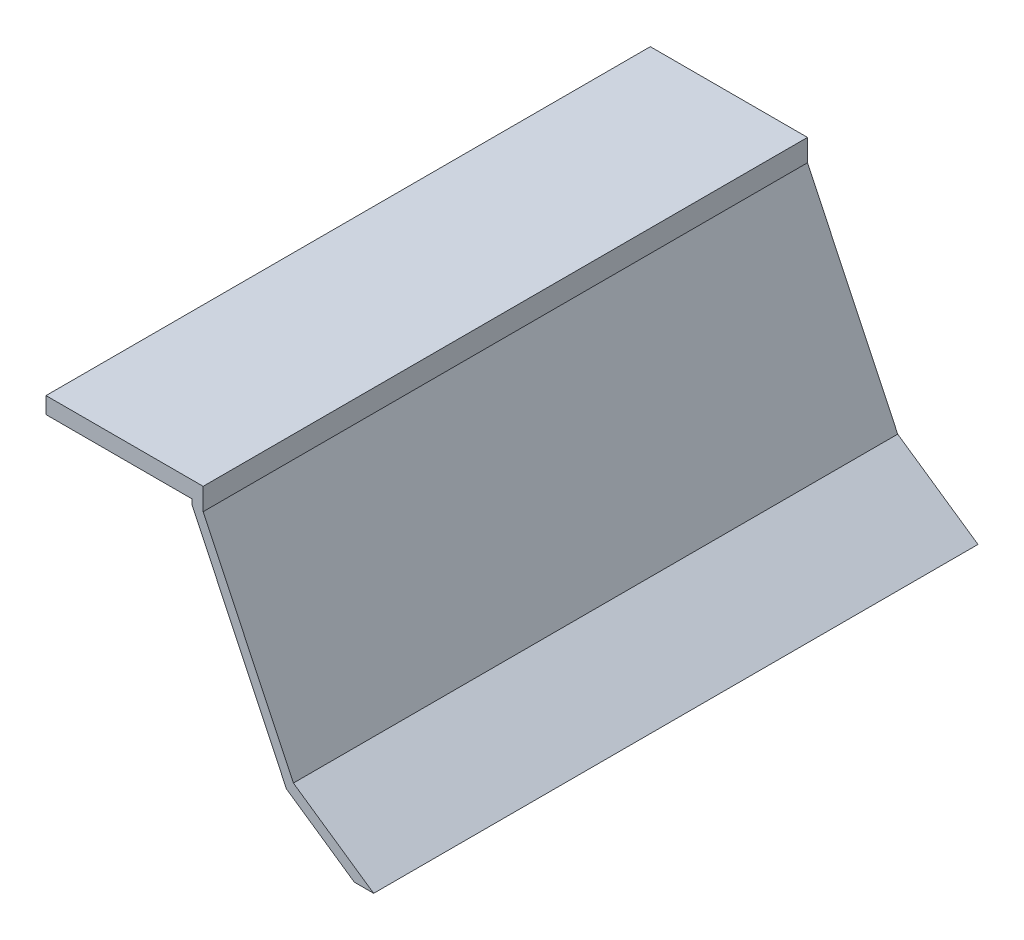
ISO-10303-21;
HEADER;
FILE_DESCRIPTION(('STEP AP214'),'2;1');
FILE_NAME('part.step','',(''),(''),'','','');
FILE_SCHEMA(('AUTOMOTIVE_DESIGN { 1 0 10303 214 1 1 1 1 }'));
ENDSEC;
DATA;
#1=APPLICATION_CONTEXT('core data for automotive mechanical design processes');
#2=APPLICATION_PROTOCOL_DEFINITION('international standard','automotive_design',2000,#1);
#3=PRODUCT_CONTEXT('',#1,'mechanical');
#4=PRODUCT('Part','Part','',(#3));
#5=PRODUCT_RELATED_PRODUCT_CATEGORY('part','',(#4));
#6=PRODUCT_DEFINITION_FORMATION('','',#4);
#7=PRODUCT_DEFINITION_CONTEXT('part definition',#1,'design');
#8=PRODUCT_DEFINITION('design','',#6,#7);
#9=PRODUCT_DEFINITION_SHAPE('','',#8);
#10=(LENGTH_UNIT() NAMED_UNIT(*) SI_UNIT(.MILLI.,.METRE.));
#11=(NAMED_UNIT(*) PLANE_ANGLE_UNIT() SI_UNIT($,.RADIAN.));
#12=(NAMED_UNIT(*) SI_UNIT($,.STERADIAN.) SOLID_ANGLE_UNIT());
#13=UNCERTAINTY_MEASURE_WITH_UNIT(LENGTH_MEASURE(1.E-05),#10,'distance_accuracy_value','');
#14=(GEOMETRIC_REPRESENTATION_CONTEXT(3) GLOBAL_UNCERTAINTY_ASSIGNED_CONTEXT((#13)) GLOBAL_UNIT_ASSIGNED_CONTEXT((#10,
#11,#12)) REPRESENTATION_CONTEXT('',''));
#15=CARTESIAN_POINT('',(0.,0.,0.));
#16=DIRECTION('',(0.,0.,1.));
#17=DIRECTION('',(1.,0.,0.));
#18=AXIS2_PLACEMENT_3D('',#15,#16,#17);
#19=CARTESIAN_POINT('',(0.,0.,110.));
#20=DIRECTION('',(1.,0.,0.));
#21=DIRECTION('',(0.,1.,0.));
#22=AXIS2_PLACEMENT_3D('',#19,#20,#21);
#23=PLANE('',#22);
#24=DIRECTION('',(0.,-1.,0.));
#25=VECTOR('',#24,1.);
#26=CARTESIAN_POINT('',(0.,0.,0.));
#27=LINE('',#26,#25);
#28=CARTESIAN_POINT('',(0.,0.,0.));
#29=VERTEX_POINT('',#28);
#30=CARTESIAN_POINT('',(0.,-3.,0.));
#31=VERTEX_POINT('',#30);
#32=EDGE_CURVE('E141',#29,#31,#27,.T.);
#33=ORIENTED_EDGE('',*,*,#32,.T.);
#34=DIRECTION('',(0.,0.,-1.));
#35=VECTOR('',#34,1.);
#36=CARTESIAN_POINT('',(0.,-3.,110.));
#37=LINE('',#36,#35);
#38=CARTESIAN_POINT('',(0.,-3.,110.));
#39=VERTEX_POINT('',#38);
#40=EDGE_CURVE('E11',#39,#31,#37,.T.);
#41=ORIENTED_EDGE('',*,*,#40,.F.);
#42=DIRECTION('',(0.,-1.,0.));
#43=VECTOR('',#42,1.);
#44=CARTESIAN_POINT('',(0.,0.,110.));
#45=LINE('',#44,#43);
#46=CARTESIAN_POINT('',(0.,0.,110.));
#47=VERTEX_POINT('',#46);
#48=EDGE_CURVE('E159',#47,#39,#45,.T.);
#49=ORIENTED_EDGE('',*,*,#48,.F.);
#50=DIRECTION('',(0.,0.,-1.));
#51=VECTOR('',#50,1.);
#52=CARTESIAN_POINT('',(0.,0.,110.));
#53=LINE('',#52,#51);
#54=EDGE_CURVE('E137',#47,#29,#53,.T.);
#55=ORIENTED_EDGE('',*,*,#54,.T.);
#56=EDGE_LOOP('',(#33,#41,#49,#55));
#57=FACE_BOUND('',#56,.T.);
#58=ADVANCED_FACE('F33',(#57),#23,.F.);
#59=CARTESIAN_POINT('',(0.,-3.,110.));
#60=DIRECTION('',(0.,1.,0.));
#61=DIRECTION('',(0.,0.,1.));
#62=AXIS2_PLACEMENT_3D('',#59,#60,#61);
#63=PLANE('',#62);
#64=DIRECTION('',(1.,0.,0.));
#65=VECTOR('',#64,1.);
#66=CARTESIAN_POINT('',(0.,-3.,0.));
#67=LINE('',#66,#65);
#68=CARTESIAN_POINT('',(26.6072373557019,-3.,0.));
#69=VERTEX_POINT('',#68);
#70=EDGE_CURVE('E144',#31,#69,#67,.T.);
#71=ORIENTED_EDGE('',*,*,#70,.T.);
#72=DIRECTION('',(0.,0.,-1.));
#73=VECTOR('',#72,1.);
#74=CARTESIAN_POINT('',(26.6072373557019,-3.,110.));
#75=LINE('',#74,#73);
#76=CARTESIAN_POINT('',(26.6072373557019,-3.,110.));
#77=VERTEX_POINT('',#76);
#78=EDGE_CURVE('E41',#77,#69,#75,.T.);
#79=ORIENTED_EDGE('',*,*,#78,.F.);
#80=DIRECTION('',(1.,0.,0.));
#81=VECTOR('',#80,1.);
#82=CARTESIAN_POINT('',(0.,-3.,110.));
#83=LINE('',#82,#81);
#84=EDGE_CURVE('E98',#39,#77,#83,.T.);
#85=ORIENTED_EDGE('',*,*,#84,.F.);
#86=ORIENTED_EDGE('',*,*,#40,.T.);
#87=EDGE_LOOP('',(#71,#79,#85,#86));
#88=FACE_BOUND('',#87,.T.);
#89=ADVANCED_FACE('F208',(#88),#63,.F.);
#90=CARTESIAN_POINT('',(26.6072373557019,-4.,110.));
#91=DIRECTION('',(1.,0.,0.));
#92=DIRECTION('',(0.,1.,0.));
#93=AXIS2_PLACEMENT_3D('',#90,#91,#92);
#94=PLANE('',#93);
#95=DIRECTION('',(0.,-1.,0.));
#96=VECTOR('',#95,1.);
#97=CARTESIAN_POINT('',(26.6072373557019,-4.,0.));
#98=LINE('',#97,#96);
#99=CARTESIAN_POINT('',(26.6072373557019,-4.,0.));
#100=VERTEX_POINT('',#99);
#101=EDGE_CURVE('E146',#69,#100,#98,.T.);
#102=ORIENTED_EDGE('',*,*,#101,.T.);
#103=DIRECTION('',(0.,0.,-1.));
#104=VECTOR('',#103,1.);
#105=CARTESIAN_POINT('',(26.6072373557019,-4.,110.));
#106=LINE('',#105,#104);
#107=CARTESIAN_POINT('',(26.6072373557019,-4.,110.));
#108=VERTEX_POINT('',#107);
#109=EDGE_CURVE('E172',#108,#100,#106,.T.);
#110=ORIENTED_EDGE('',*,*,#109,.F.);
#111=DIRECTION('',(0.,-1.,0.));
#112=VECTOR('',#111,1.);
#113=CARTESIAN_POINT('',(26.6072373557019,-4.,110.));
#114=LINE('',#113,#112);
#115=EDGE_CURVE('E180',#77,#108,#114,.T.);
#116=ORIENTED_EDGE('',*,*,#115,.F.);
#117=ORIENTED_EDGE('',*,*,#78,.T.);
#118=EDGE_LOOP('',(#102,#110,#116,#117));
#119=FACE_BOUND('',#118,.T.);
#120=ADVANCED_FACE('F178',(#119),#94,.F.);
#121=CARTESIAN_POINT('',(43.7728855673984,-40.1294965571384,110.));
#122=DIRECTION('',(0.903237413928461,0.429141205292414,0.));
#123=DIRECTION('',(-0.429141205292414,0.903237413928461,0.));
#124=AXIS2_PLACEMENT_3D('',#121,#122,#123);
#125=PLANE('',#124);
#126=DIRECTION('',(0.429141205292414,-0.903237413928461,0.));
#127=VECTOR('',#126,1.);
#128=CARTESIAN_POINT('',(43.7728855673984,-40.1294965571384,0.));
#129=LINE('',#128,#127);
#130=CARTESIAN_POINT('',(43.7728855673984,-40.1294965571384,0.));
#131=VERTEX_POINT('',#130);
#132=EDGE_CURVE('E148',#100,#131,#129,.T.);
#133=ORIENTED_EDGE('',*,*,#132,.T.);
#134=DIRECTION('',(0.,0.,-1.));
#135=VECTOR('',#134,1.);
#136=CARTESIAN_POINT('',(43.7728855673984,-40.1294965571384,110.));
#137=LINE('',#136,#135);
#138=CARTESIAN_POINT('',(43.7728855673984,-40.1294965571384,110.));
#139=VERTEX_POINT('',#138);
#140=EDGE_CURVE('E169',#139,#131,#137,.T.);
#141=ORIENTED_EDGE('',*,*,#140,.F.);
#142=DIRECTION('',(0.429141205292414,-0.903237413928461,0.));
#143=VECTOR('',#142,1.);
#144=CARTESIAN_POINT('',(43.7728855673984,-40.1294965571384,110.));
#145=LINE('',#144,#143);
#146=EDGE_CURVE('E198',#108,#139,#145,.T.);
#147=ORIENTED_EDGE('',*,*,#146,.F.);
#148=ORIENTED_EDGE('',*,*,#109,.T.);
#149=EDGE_LOOP('',(#133,#141,#147,#148));
#150=FACE_BOUND('',#149,.T.);
#151=ADVANCED_FACE('F189',(#150),#125,.F.);
#152=CARTESIAN_POINT('',(56.1218739557704,-48.6443357091044,110.));
#153=DIRECTION('',(0.5676559434644,0.823265892558134,0.));
#154=DIRECTION('',(-0.823265892558134,0.5676559434644,0.));
#155=AXIS2_PLACEMENT_3D('',#152,#153,#154);
#156=PLANE('',#155);
#157=DIRECTION('',(0.823265892558134,-0.5676559434644,0.));
#158=VECTOR('',#157,1.);
#159=CARTESIAN_POINT('',(56.1218739557704,-48.6443357091044,0.));
#160=LINE('',#159,#158);
#161=CARTESIAN_POINT('',(56.1218739557704,-48.6443357091044,0.));
#162=VERTEX_POINT('',#161);
#163=EDGE_CURVE('E150',#131,#162,#160,.T.);
#164=ORIENTED_EDGE('',*,*,#163,.T.);
#165=DIRECTION('',(0.,0.,-1.));
#166=VECTOR('',#165,1.);
#167=CARTESIAN_POINT('',(56.1218739557704,-48.6443357091044,110.));
#168=LINE('',#167,#166);
#169=CARTESIAN_POINT('',(56.1218739557704,-48.6443357091044,110.));
#170=VERTEX_POINT('',#169);
#171=EDGE_CURVE('E166',#170,#162,#168,.T.);
#172=ORIENTED_EDGE('',*,*,#171,.F.);
#173=DIRECTION('',(0.823265892558134,-0.5676559434644,0.));
#174=VECTOR('',#173,1.);
#175=CARTESIAN_POINT('',(56.1218739557704,-48.6443357091044,110.));
#176=LINE('',#175,#174);
#177=EDGE_CURVE('E195',#139,#170,#176,.T.);
#178=ORIENTED_EDGE('',*,*,#177,.F.);
#179=ORIENTED_EDGE('',*,*,#140,.T.);
#180=EDGE_LOOP('',(#164,#172,#178,#179));
#181=FACE_BOUND('',#180,.T.);
#182=ADVANCED_FACE('F193',(#181),#156,.F.);
#183=CARTESIAN_POINT('',(59.6451348729274,-48.6443357091044,110.));
#184=DIRECTION('',(0.,1.,0.));
#185=DIRECTION('',(-1.,0.,0.));
#186=AXIS2_PLACEMENT_3D('',#183,#184,#185);
#187=PLANE('',#186);
#188=DIRECTION('',(1.,0.,0.));
#189=VECTOR('',#188,1.);
#190=CARTESIAN_POINT('',(59.6451348729274,-48.6443357091044,0.));
#191=LINE('',#190,#189);
#192=CARTESIAN_POINT('',(59.6451348729274,-48.6443357091044,0.));
#193=VERTEX_POINT('',#192);
#194=EDGE_CURVE('E152',#162,#193,#191,.T.);
#195=ORIENTED_EDGE('',*,*,#194,.T.);
#196=DIRECTION('',(0.,0.,-1.));
#197=VECTOR('',#196,1.);
#198=CARTESIAN_POINT('',(59.6451348729274,-48.6443357091044,110.));
#199=LINE('',#198,#197);
#200=CARTESIAN_POINT('',(59.6451348729274,-48.6443357091044,110.));
#201=VERTEX_POINT('',#200);
#202=EDGE_CURVE('E163',#201,#193,#199,.T.);
#203=ORIENTED_EDGE('',*,*,#202,.F.);
#204=DIRECTION('',(1.,0.,0.));
#205=VECTOR('',#204,1.);
#206=CARTESIAN_POINT('',(59.6451348729274,-48.6443357091044,110.));
#207=LINE('',#206,#205);
#208=EDGE_CURVE('E197',#170,#201,#207,.T.);
#209=ORIENTED_EDGE('',*,*,#208,.F.);
#210=ORIENTED_EDGE('',*,*,#171,.T.);
#211=EDGE_LOOP('',(#195,#203,#209,#210));
#212=FACE_BOUND('',#211,.T.);
#213=ADVANCED_FACE('F220',(#212),#187,.F.);
#214=CARTESIAN_POINT('',(45.0312597898075,-38.5678183615896,110.));
#215=DIRECTION('',(-0.567655943464399,-0.823265892558135,0.));
#216=DIRECTION('',(0.823265892558135,-0.567655943464399,0.));
#217=AXIS2_PLACEMENT_3D('',#214,#215,#216);
#218=PLANE('',#217);
#219=DIRECTION('',(-0.823265892558135,0.567655943464399,0.));
#220=VECTOR('',#219,1.);
#221=CARTESIAN_POINT('',(45.0312597898075,-38.5678183615896,0.));
#222=LINE('',#221,#220);
#223=CARTESIAN_POINT('',(45.0312597898075,-38.5678183615896,0.));
#224=VERTEX_POINT('',#223);
#225=EDGE_CURVE('E154',#193,#224,#222,.T.);
#226=ORIENTED_EDGE('',*,*,#225,.T.);
#227=DIRECTION('',(0.,0.,-1.));
#228=VECTOR('',#227,1.);
#229=CARTESIAN_POINT('',(45.0312597898075,-38.5678183615896,110.));
#230=LINE('',#229,#228);
#231=CARTESIAN_POINT('',(45.0312597898075,-38.5678183615896,110.));
#232=VERTEX_POINT('',#231);
#233=EDGE_CURVE('E132',#232,#224,#230,.T.);
#234=ORIENTED_EDGE('',*,*,#233,.F.);
#235=DIRECTION('',(-0.823265892558135,0.567655943464399,0.));
#236=VECTOR('',#235,1.);
#237=CARTESIAN_POINT('',(45.0312597898075,-38.5678183615896,110.));
#238=LINE('',#237,#236);
#239=EDGE_CURVE('E123',#201,#232,#238,.T.);
#240=ORIENTED_EDGE('',*,*,#239,.F.);
#241=ORIENTED_EDGE('',*,*,#202,.T.);
#242=EDGE_LOOP('',(#226,#234,#240,#241));
#243=FACE_BOUND('',#242,.T.);
#244=ADVANCED_FACE('F223',(#243),#218,.F.);
#245=CARTESIAN_POINT('',(28.6072372197727,-3.99926262862854,110.));
#246=DIRECTION('',(-0.903237413928461,-0.429141205292414,0.));
#247=DIRECTION('',(0.429141205292414,-0.903237413928461,0.));
#248=AXIS2_PLACEMENT_3D('',#245,#246,#247);
#249=PLANE('',#248);
#250=DIRECTION('',(-0.429141205292414,0.903237413928461,0.));
#251=VECTOR('',#250,1.);
#252=CARTESIAN_POINT('',(28.6072372197727,-3.99926262862854,0.));
#253=LINE('',#252,#251);
#254=CARTESIAN_POINT('',(28.6072372197727,-3.99926262862854,0.));
#255=VERTEX_POINT('',#254);
#256=EDGE_CURVE('E131',#224,#255,#253,.T.);
#257=ORIENTED_EDGE('',*,*,#256,.T.);
#258=DIRECTION('',(0.,0.,-1.));
#259=VECTOR('',#258,1.);
#260=CARTESIAN_POINT('',(28.6072372197727,-3.99926262862854,110.));
#261=LINE('',#260,#259);
#262=CARTESIAN_POINT('',(28.6072372197727,-3.99926262862854,110.));
#263=VERTEX_POINT('',#262);
#264=EDGE_CURVE('E128',#263,#255,#261,.T.);
#265=ORIENTED_EDGE('',*,*,#264,.F.);
#266=DIRECTION('',(-0.429141205292414,0.903237413928461,0.));
#267=VECTOR('',#266,1.);
#268=CARTESIAN_POINT('',(28.6072372197727,-3.99926262862854,110.));
#269=LINE('',#268,#267);
#270=EDGE_CURVE('E117',#232,#263,#269,.T.);
#271=ORIENTED_EDGE('',*,*,#270,.F.);
#272=ORIENTED_EDGE('',*,*,#233,.T.);
#273=EDGE_LOOP('',(#257,#265,#271,#272));
#274=FACE_BOUND('',#273,.T.);
#275=ADVANCED_FACE('F129',(#274),#249,.F.);
#276=CARTESIAN_POINT('',(28.6072372197727,0.,110.));
#277=DIRECTION('',(-1.,0.,0.));
#278=DIRECTION('',(0.,-1.,0.));
#279=AXIS2_PLACEMENT_3D('',#276,#277,#278);
#280=PLANE('',#279);
#281=DIRECTION('',(0.,1.,0.));
#282=VECTOR('',#281,1.);
#283=CARTESIAN_POINT('',(28.6072372197727,0.,0.));
#284=LINE('',#283,#282);
#285=CARTESIAN_POINT('',(28.6072372197727,0.,0.));
#286=VERTEX_POINT('',#285);
#287=EDGE_CURVE('E84',#255,#286,#284,.T.);
#288=ORIENTED_EDGE('',*,*,#287,.T.);
#289=DIRECTION('',(0.,0.,-1.));
#290=VECTOR('',#289,1.);
#291=CARTESIAN_POINT('',(28.6072372197727,0.,110.));
#292=LINE('',#291,#290);
#293=CARTESIAN_POINT('',(28.6072372197727,0.,110.));
#294=VERTEX_POINT('',#293);
#295=EDGE_CURVE('E133',#294,#286,#292,.T.);
#296=ORIENTED_EDGE('',*,*,#295,.F.);
#297=DIRECTION('',(0.,1.,0.));
#298=VECTOR('',#297,1.);
#299=CARTESIAN_POINT('',(28.6072372197727,0.,110.));
#300=LINE('',#299,#298);
#301=EDGE_CURVE('E121',#263,#294,#300,.T.);
#302=ORIENTED_EDGE('',*,*,#301,.F.);
#303=ORIENTED_EDGE('',*,*,#264,.T.);
#304=EDGE_LOOP('',(#288,#296,#302,#303));
#305=FACE_BOUND('',#304,.T.);
#306=ADVANCED_FACE('F135',(#305),#280,.F.);
#307=CARTESIAN_POINT('',(0.,0.,110.));
#308=DIRECTION('',(0.,-1.,0.));
#309=DIRECTION('',(0.,0.,-1.));
#310=AXIS2_PLACEMENT_3D('',#307,#308,#309);
#311=PLANE('',#310);
#312=DIRECTION('',(-1.,0.,0.));
#313=VECTOR('',#312,1.);
#314=CARTESIAN_POINT('',(0.,0.,0.));
#315=LINE('',#314,#313);
#316=EDGE_CURVE('E90',#286,#29,#315,.T.);
#317=ORIENTED_EDGE('',*,*,#316,.T.);
#318=ORIENTED_EDGE('',*,*,#54,.F.);
#319=DIRECTION('',(-1.,0.,0.));
#320=VECTOR('',#319,1.);
#321=CARTESIAN_POINT('',(0.,0.,110.));
#322=LINE('',#321,#320);
#323=EDGE_CURVE('E49',#294,#47,#322,.T.);
#324=ORIENTED_EDGE('',*,*,#323,.F.);
#325=ORIENTED_EDGE('',*,*,#295,.T.);
#326=EDGE_LOOP('',(#317,#318,#324,#325));
#327=FACE_BOUND('',#326,.T.);
#328=ADVANCED_FACE('F232',(#327),#311,.F.);
#329=CARTESIAN_POINT('',(0.,0.,110.));
#330=DIRECTION('',(0.,0.,1.));
#331=DIRECTION('',(1.,0.,0.));
#332=AXIS2_PLACEMENT_3D('',#329,#330,#331);
#333=PLANE('',#332);
#334=ORIENTED_EDGE('',*,*,#48,.T.);
#335=ORIENTED_EDGE('',*,*,#84,.T.);
#336=ORIENTED_EDGE('',*,*,#115,.T.);
#337=ORIENTED_EDGE('',*,*,#146,.T.);
#338=ORIENTED_EDGE('',*,*,#177,.T.);
#339=ORIENTED_EDGE('',*,*,#208,.T.);
#340=ORIENTED_EDGE('',*,*,#239,.T.);
#341=ORIENTED_EDGE('',*,*,#270,.T.);
#342=ORIENTED_EDGE('',*,*,#301,.T.);
#343=ORIENTED_EDGE('',*,*,#323,.T.);
#344=EDGE_LOOP('',(#334,#335,#336,#337,#338,#339,#340,#341,#342,#343));
#345=FACE_BOUND('',#344,.T.);
#346=ADVANCED_FACE('F119',(#345),#333,.T.);
#347=CARTESIAN_POINT('',(0.,0.,0.));
#348=DIRECTION('',(0.,0.,1.));
#349=DIRECTION('',(1.,0.,0.));
#350=AXIS2_PLACEMENT_3D('',#347,#348,#349);
#351=PLANE('',#350);
#352=ORIENTED_EDGE('',*,*,#32,.F.);
#353=ORIENTED_EDGE('',*,*,#316,.F.);
#354=ORIENTED_EDGE('',*,*,#287,.F.);
#355=ORIENTED_EDGE('',*,*,#256,.F.);
#356=ORIENTED_EDGE('',*,*,#225,.F.);
#357=ORIENTED_EDGE('',*,*,#194,.F.);
#358=ORIENTED_EDGE('',*,*,#163,.F.);
#359=ORIENTED_EDGE('',*,*,#132,.F.);
#360=ORIENTED_EDGE('',*,*,#101,.F.);
#361=ORIENTED_EDGE('',*,*,#70,.F.);
#362=EDGE_LOOP('',(#352,#353,#354,#355,#356,#357,#358,#359,#360,#361));
#363=FACE_BOUND('',#362,.T.);
#364=ADVANCED_FACE('F184',(#363),#351,.F.);
#365=CLOSED_SHELL('',(#58,#89,#120,#151,#182,#213,#244,#275,#306,#328,#346,#364));
#366=MANIFOLD_SOLID_BREP('B2',#365);
#367=ADVANCED_BREP_SHAPE_REPRESENTATION('',(#18,#366),#14);
#368=SHAPE_DEFINITION_REPRESENTATION(#9,#367);
ENDSEC;
END-ISO-10303-21;
